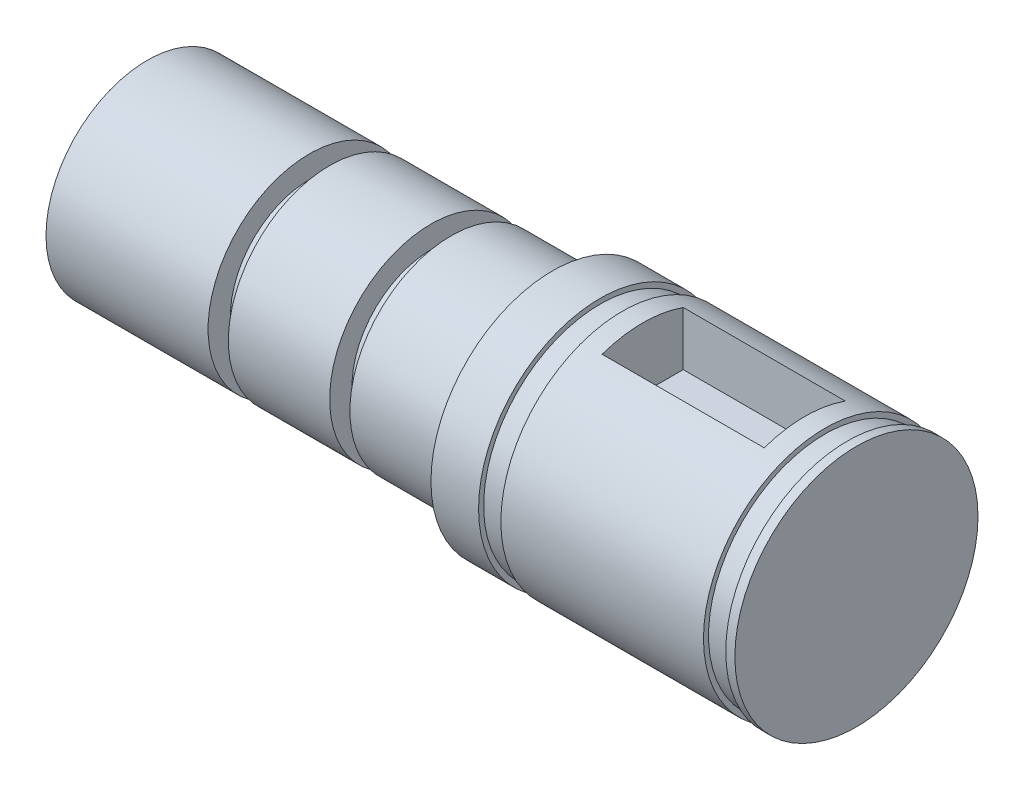
ISO-10303-21;
HEADER;
FILE_DESCRIPTION(('STEP AP214'),'2;1');
FILE_NAME('part.step','',(''),(''),'','','');
FILE_SCHEMA(('AUTOMOTIVE_DESIGN { 1 0 10303 214 1 1 1 1 }'));
ENDSEC;
DATA;
#1=APPLICATION_CONTEXT('core data for automotive mechanical design processes');
#2=APPLICATION_PROTOCOL_DEFINITION('international standard','automotive_design',2000,#1);
#3=PRODUCT_CONTEXT('',#1,'mechanical');
#4=PRODUCT('Part','Part','',(#3));
#5=PRODUCT_RELATED_PRODUCT_CATEGORY('part','',(#4));
#6=PRODUCT_DEFINITION_FORMATION('','',#4);
#7=PRODUCT_DEFINITION_CONTEXT('part definition',#1,'design');
#8=PRODUCT_DEFINITION('design','',#6,#7);
#9=PRODUCT_DEFINITION_SHAPE('','',#8);
#10=(LENGTH_UNIT() NAMED_UNIT(*) SI_UNIT(.MILLI.,.METRE.));
#11=(NAMED_UNIT(*) PLANE_ANGLE_UNIT() SI_UNIT($,.RADIAN.));
#12=(NAMED_UNIT(*) SI_UNIT($,.STERADIAN.) SOLID_ANGLE_UNIT());
#13=UNCERTAINTY_MEASURE_WITH_UNIT(LENGTH_MEASURE(1.E-05),#10,'distance_accuracy_value','');
#14=(GEOMETRIC_REPRESENTATION_CONTEXT(3) GLOBAL_UNCERTAINTY_ASSIGNED_CONTEXT((#13)) GLOBAL_UNIT_ASSIGNED_CONTEXT((#10,
#11,#12)) REPRESENTATION_CONTEXT('',''));
#15=CARTESIAN_POINT('',(0.,0.,0.));
#16=DIRECTION('',(0.,0.,1.));
#17=DIRECTION('',(1.,0.,0.));
#18=AXIS2_PLACEMENT_3D('',#15,#16,#17);
#19=CARTESIAN_POINT('',(15.,0.,0.));
#20=DIRECTION('',(-1.,0.,0.));
#21=DIRECTION('',(0.,0.,1.));
#22=AXIS2_PLACEMENT_3D('',#19,#20,#21);
#23=CYLINDRICAL_SURFACE('',#22,6.);
#24=CARTESIAN_POINT('',(13.45,0.,0.));
#25=DIRECTION('',(1.,0.,0.));
#26=DIRECTION('',(0.,0.,-1.));
#27=AXIS2_PLACEMENT_3D('',#24,#25,#26);
#28=CIRCLE('',#27,6.);
#29=CARTESIAN_POINT('',(13.45,0.,-6.));
#30=VERTEX_POINT('',#29);
#31=EDGE_CURVE('E185',#30,#30,#28,.T.);
#32=ORIENTED_EDGE('',*,*,#31,.F.);
#33=EDGE_LOOP('',(#32));
#34=FACE_BOUND('',#33,.T.);
#35=DIRECTION('',(-1.,0.,0.));
#36=VECTOR('',#35,1.);
#37=CARTESIAN_POINT('',(15.,5.65685424949238,2.));
#38=LINE('',#37,#36);
#39=CARTESIAN_POINT('',(12.45,5.65685424949238,2.));
#40=VERTEX_POINT('',#39);
#41=CARTESIAN_POINT('',(4.45,5.65685424949238,2.));
#42=VERTEX_POINT('',#41);
#43=EDGE_CURVE('E11',#40,#42,#38,.T.);
#44=ORIENTED_EDGE('',*,*,#43,.T.);
#45=CARTESIAN_POINT('',(4.45,0.,0.));
#46=DIRECTION('',(-1.,0.,0.));
#47=DIRECTION('',(0.,0.,1.));
#48=AXIS2_PLACEMENT_3D('',#45,#46,#47);
#49=CIRCLE('',#48,6.);
#50=CARTESIAN_POINT('',(4.45,5.65685424949238,-2.));
#51=VERTEX_POINT('',#50);
#52=EDGE_CURVE('E119',#42,#51,#49,.T.);
#53=ORIENTED_EDGE('',*,*,#52,.T.);
#54=DIRECTION('',(-1.,0.,0.));
#55=VECTOR('',#54,1.);
#56=CARTESIAN_POINT('',(15.,5.65685424949238,-2.));
#57=LINE('',#56,#55);
#58=CARTESIAN_POINT('',(12.45,5.65685424949238,-2.));
#59=VERTEX_POINT('',#58);
#60=EDGE_CURVE('E46',#51,#59,#57,.F.);
#61=ORIENTED_EDGE('',*,*,#60,.T.);
#62=CARTESIAN_POINT('',(12.45,0.,0.));
#63=DIRECTION('',(1.,0.,0.));
#64=DIRECTION('',(0.,0.,-1.));
#65=AXIS2_PLACEMENT_3D('',#62,#63,#64);
#66=CIRCLE('',#65,6.);
#67=EDGE_CURVE('E53',#59,#40,#66,.T.);
#68=ORIENTED_EDGE('',*,*,#67,.T.);
#69=EDGE_LOOP('',(#44,#53,#61,#68));
#70=FACE_BOUND('',#69,.T.);
#71=CARTESIAN_POINT('',(3.45,0.,0.));
#72=DIRECTION('',(1.,0.,0.));
#73=DIRECTION('',(0.,0.,-1.));
#74=AXIS2_PLACEMENT_3D('',#71,#72,#73);
#75=CIRCLE('',#74,6.);
#76=CARTESIAN_POINT('',(3.45,0.,-6.));
#77=VERTEX_POINT('',#76);
#78=EDGE_CURVE('E246',#77,#77,#75,.T.);
#79=ORIENTED_EDGE('',*,*,#78,.T.);
#80=EDGE_LOOP('',(#79));
#81=FACE_BOUND('',#80,.T.);
#82=ADVANCED_FACE('F38',(#34,#70,#81),#23,.T.);
#83=CARTESIAN_POINT('',(12.45,3.,2.));
#84=DIRECTION('',(1.,0.,0.));
#85=DIRECTION('',(0.,0.,-1.));
#86=AXIS2_PLACEMENT_3D('',#83,#84,#85);
#87=PLANE('',#86);
#88=DIRECTION('',(0.,1.,0.));
#89=VECTOR('',#88,1.);
#90=CARTESIAN_POINT('',(12.45,3.,-2.));
#91=LINE('',#90,#89);
#92=CARTESIAN_POINT('',(12.45,3.,-2.));
#93=VERTEX_POINT('',#92);
#94=EDGE_CURVE('E76',#93,#59,#91,.T.);
#95=ORIENTED_EDGE('',*,*,#94,.F.);
#96=DIRECTION('',(0.,0.,-1.));
#97=VECTOR('',#96,1.);
#98=CARTESIAN_POINT('',(12.45,3.,2.));
#99=LINE('',#98,#97);
#100=CARTESIAN_POINT('',(12.45,3.,2.));
#101=VERTEX_POINT('',#100);
#102=EDGE_CURVE('E80',#101,#93,#99,.T.);
#103=ORIENTED_EDGE('',*,*,#102,.F.);
#104=DIRECTION('',(0.,1.,0.));
#105=VECTOR('',#104,1.);
#106=CARTESIAN_POINT('',(12.45,3.,2.));
#107=LINE('',#106,#105);
#108=EDGE_CURVE('E107',#101,#40,#107,.T.);
#109=ORIENTED_EDGE('',*,*,#108,.T.);
#110=ORIENTED_EDGE('',*,*,#67,.F.);
#111=EDGE_LOOP('',(#95,#103,#109,#110));
#112=FACE_BOUND('',#111,.T.);
#113=ADVANCED_FACE('F78',(#112),#87,.F.);
#114=CARTESIAN_POINT('',(4.45,3.,2.));
#115=DIRECTION('',(0.,0.,1.));
#116=DIRECTION('',(1.,0.,0.));
#117=AXIS2_PLACEMENT_3D('',#114,#115,#116);
#118=PLANE('',#117);
#119=ORIENTED_EDGE('',*,*,#108,.F.);
#120=DIRECTION('',(1.,0.,0.));
#121=VECTOR('',#120,1.);
#122=CARTESIAN_POINT('',(4.45,3.,2.));
#123=LINE('',#122,#121);
#124=CARTESIAN_POINT('',(4.45,3.,2.));
#125=VERTEX_POINT('',#124);
#126=EDGE_CURVE('E85',#125,#101,#123,.T.);
#127=ORIENTED_EDGE('',*,*,#126,.F.);
#128=DIRECTION('',(0.,1.,0.));
#129=VECTOR('',#128,1.);
#130=CARTESIAN_POINT('',(4.45,3.,2.));
#131=LINE('',#130,#129);
#132=EDGE_CURVE('E110',#125,#42,#131,.T.);
#133=ORIENTED_EDGE('',*,*,#132,.T.);
#134=ORIENTED_EDGE('',*,*,#43,.F.);
#135=EDGE_LOOP('',(#119,#127,#133,#134));
#136=FACE_BOUND('',#135,.T.);
#137=ADVANCED_FACE('F131',(#136),#118,.F.);
#138=CARTESIAN_POINT('',(4.45,3.,2.));
#139=DIRECTION('',(-1.,0.,0.));
#140=DIRECTION('',(0.,0.,1.));
#141=AXIS2_PLACEMENT_3D('',#138,#139,#140);
#142=PLANE('',#141);
#143=ORIENTED_EDGE('',*,*,#132,.F.);
#144=DIRECTION('',(0.,0.,1.));
#145=VECTOR('',#144,1.);
#146=CARTESIAN_POINT('',(4.45,3.,2.));
#147=LINE('',#146,#145);
#148=CARTESIAN_POINT('',(4.45,3.,-2.));
#149=VERTEX_POINT('',#148);
#150=EDGE_CURVE('E94',#149,#125,#147,.T.);
#151=ORIENTED_EDGE('',*,*,#150,.F.);
#152=DIRECTION('',(0.,1.,0.));
#153=VECTOR('',#152,1.);
#154=CARTESIAN_POINT('',(4.45,3.,-2.));
#155=LINE('',#154,#153);
#156=EDGE_CURVE('E84',#149,#51,#155,.T.);
#157=ORIENTED_EDGE('',*,*,#156,.T.);
#158=ORIENTED_EDGE('',*,*,#52,.F.);
#159=EDGE_LOOP('',(#143,#151,#157,#158));
#160=FACE_BOUND('',#159,.T.);
#161=ADVANCED_FACE('F130',(#160),#142,.F.);
#162=CARTESIAN_POINT('',(4.45,3.,-2.));
#163=DIRECTION('',(0.,0.,-1.));
#164=DIRECTION('',(-1.,0.,0.));
#165=AXIS2_PLACEMENT_3D('',#162,#163,#164);
#166=PLANE('',#165);
#167=ORIENTED_EDGE('',*,*,#156,.F.);
#168=DIRECTION('',(-1.,0.,0.));
#169=VECTOR('',#168,1.);
#170=CARTESIAN_POINT('',(4.45,3.,-2.));
#171=LINE('',#170,#169);
#172=EDGE_CURVE('E88',#93,#149,#171,.T.);
#173=ORIENTED_EDGE('',*,*,#172,.F.);
#174=ORIENTED_EDGE('',*,*,#94,.T.);
#175=ORIENTED_EDGE('',*,*,#60,.F.);
#176=EDGE_LOOP('',(#167,#173,#174,#175));
#177=FACE_BOUND('',#176,.T.);
#178=ADVANCED_FACE('F89',(#177),#166,.F.);
#179=CARTESIAN_POINT('',(0.,3.,0.));
#180=DIRECTION('',(0.,-1.,0.));
#181=DIRECTION('',(0.,0.,-1.));
#182=AXIS2_PLACEMENT_3D('',#179,#180,#181);
#183=PLANE('',#182);
#184=ORIENTED_EDGE('',*,*,#102,.T.);
#185=ORIENTED_EDGE('',*,*,#172,.T.);
#186=ORIENTED_EDGE('',*,*,#150,.T.);
#187=ORIENTED_EDGE('',*,*,#126,.T.);
#188=EDGE_LOOP('',(#184,#185,#186,#187));
#189=FACE_BOUND('',#188,.T.);
#190=ADVANCED_FACE('F96',(#189),#183,.F.);
#191=CARTESIAN_POINT('',(2.35,5.75,0.));
#192=DIRECTION('',(-1.,0.,0.));
#193=DIRECTION('',(0.,0.,1.));
#194=AXIS2_PLACEMENT_3D('',#191,#192,#193);
#195=PLANE('',#194);
#196=CARTESIAN_POINT('',(2.35,0.,0.));
#197=DIRECTION('',(1.,0.,0.));
#198=DIRECTION('',(0.,0.,-1.));
#199=AXIS2_PLACEMENT_3D('',#196,#197,#198);
#200=CIRCLE('',#199,5.75);
#201=CARTESIAN_POINT('',(2.35,0.,-5.75));
#202=VERTEX_POINT('',#201);
#203=EDGE_CURVE('E188',#202,#202,#200,.T.);
#204=ORIENTED_EDGE('',*,*,#203,.F.);
#205=EDGE_LOOP('',(#204));
#206=FACE_BOUND('',#205,.T.);
#207=CARTESIAN_POINT('',(2.35,0.,0.));
#208=DIRECTION('',(1.,0.,0.));
#209=DIRECTION('',(0.,0.,-1.));
#210=AXIS2_PLACEMENT_3D('',#207,#208,#209);
#211=CIRCLE('',#210,6.);
#212=CARTESIAN_POINT('',(2.35,0.,-6.));
#213=VERTEX_POINT('',#212);
#214=EDGE_CURVE('E180',#213,#213,#211,.T.);
#215=ORIENTED_EDGE('',*,*,#214,.T.);
#216=EDGE_LOOP('',(#215));
#217=FACE_BOUND('',#216,.T.);
#218=ADVANCED_FACE('F252',(#206,#217),#195,.F.);
#219=CARTESIAN_POINT('',(3.45,6.,0.));
#220=DIRECTION('',(1.,0.,0.));
#221=DIRECTION('',(0.,0.,-1.));
#222=AXIS2_PLACEMENT_3D('',#219,#220,#221);
#223=PLANE('',#222);
#224=ORIENTED_EDGE('',*,*,#78,.F.);
#225=EDGE_LOOP('',(#224));
#226=FACE_BOUND('',#225,.T.);
#227=CARTESIAN_POINT('',(3.45,0.,0.));
#228=DIRECTION('',(1.,0.,0.));
#229=DIRECTION('',(0.,0.,-1.));
#230=AXIS2_PLACEMENT_3D('',#227,#228,#229);
#231=CIRCLE('',#230,5.75);
#232=CARTESIAN_POINT('',(3.45,0.,-5.75));
#233=VERTEX_POINT('',#232);
#234=EDGE_CURVE('E244',#233,#233,#231,.T.);
#235=ORIENTED_EDGE('',*,*,#234,.T.);
#236=EDGE_LOOP('',(#235));
#237=FACE_BOUND('',#236,.T.);
#238=ADVANCED_FACE('F325',(#226,#237),#223,.F.);
#239=CARTESIAN_POINT('',(0.,0.,0.));
#240=DIRECTION('',(1.,0.,0.));
#241=DIRECTION('',(0.,0.,-1.));
#242=AXIS2_PLACEMENT_3D('',#239,#240,#241);
#243=CYLINDRICAL_SURFACE('',#242,5.75);
#244=ORIENTED_EDGE('',*,*,#234,.F.);
#245=EDGE_LOOP('',(#244));
#246=FACE_BOUND('',#245,.T.);
#247=ORIENTED_EDGE('',*,*,#203,.T.);
#248=EDGE_LOOP('',(#247));
#249=FACE_BOUND('',#248,.T.);
#250=ADVANCED_FACE('F335',(#246,#249),#243,.T.);
#251=CARTESIAN_POINT('',(13.45,6.,0.));
#252=DIRECTION('',(-1.,0.,0.));
#253=DIRECTION('',(0.,0.,1.));
#254=AXIS2_PLACEMENT_3D('',#251,#252,#253);
#255=PLANE('',#254);
#256=CARTESIAN_POINT('',(13.45,0.,0.));
#257=DIRECTION('',(1.,0.,0.));
#258=DIRECTION('',(0.,0.,-1.));
#259=AXIS2_PLACEMENT_3D('',#256,#257,#258);
#260=CIRCLE('',#259,5.75);
#261=CARTESIAN_POINT('',(13.45,0.,-5.75));
#262=VERTEX_POINT('',#261);
#263=EDGE_CURVE('E177',#262,#262,#260,.T.);
#264=ORIENTED_EDGE('',*,*,#263,.F.);
#265=EDGE_LOOP('',(#264));
#266=FACE_BOUND('',#265,.T.);
#267=ORIENTED_EDGE('',*,*,#31,.T.);
#268=EDGE_LOOP('',(#267));
#269=FACE_BOUND('',#268,.T.);
#270=ADVANCED_FACE('F345',(#266,#269),#255,.F.);
#271=CARTESIAN_POINT('',(0.,0.,0.));
#272=DIRECTION('',(1.,0.,0.));
#273=DIRECTION('',(0.,0.,-1.));
#274=AXIS2_PLACEMENT_3D('',#271,#272,#273);
#275=CYLINDRICAL_SURFACE('',#274,5.75);
#276=CARTESIAN_POINT('',(14.55,0.,0.));
#277=DIRECTION('',(1.,0.,0.));
#278=DIRECTION('',(0.,0.,-1.));
#279=AXIS2_PLACEMENT_3D('',#276,#277,#278);
#280=CIRCLE('',#279,5.75);
#281=CARTESIAN_POINT('',(14.55,0.,-5.75));
#282=VERTEX_POINT('',#281);
#283=EDGE_CURVE('E174',#282,#282,#280,.T.);
#284=ORIENTED_EDGE('',*,*,#283,.F.);
#285=EDGE_LOOP('',(#284));
#286=FACE_BOUND('',#285,.T.);
#287=ORIENTED_EDGE('',*,*,#263,.T.);
#288=EDGE_LOOP('',(#287));
#289=FACE_BOUND('',#288,.T.);
#290=ADVANCED_FACE('F355',(#286,#289),#275,.T.);
#291=CARTESIAN_POINT('',(14.55,5.75,0.));
#292=DIRECTION('',(1.,0.,0.));
#293=DIRECTION('',(0.,0.,-1.));
#294=AXIS2_PLACEMENT_3D('',#291,#292,#293);
#295=PLANE('',#294);
#296=CARTESIAN_POINT('',(14.55,0.,0.));
#297=DIRECTION('',(1.,0.,0.));
#298=DIRECTION('',(0.,0.,-1.));
#299=AXIS2_PLACEMENT_3D('',#296,#297,#298);
#300=CIRCLE('',#299,6.);
#301=CARTESIAN_POINT('',(14.55,0.,-6.));
#302=VERTEX_POINT('',#301);
#303=EDGE_CURVE('E171',#302,#302,#300,.T.);
#304=ORIENTED_EDGE('',*,*,#303,.F.);
#305=EDGE_LOOP('',(#304));
#306=FACE_BOUND('',#305,.T.);
#307=ORIENTED_EDGE('',*,*,#283,.T.);
#308=EDGE_LOOP('',(#307));
#309=FACE_BOUND('',#308,.T.);
#310=ADVANCED_FACE('F151',(#306,#309),#295,.F.);
#311=ORIENTED_EDGE('',*,*,#214,.F.);
#312=EDGE_LOOP('',(#311));
#313=FACE_BOUND('',#312,.T.);
#314=CARTESIAN_POINT('',(0.,0.,0.));
#315=DIRECTION('',(1.,0.,0.));
#316=DIRECTION('',(0.,0.,-1.));
#317=AXIS2_PLACEMENT_3D('',#314,#315,#316);
#318=CIRCLE('',#317,6.);
#319=CARTESIAN_POINT('',(0.,0.,-6.));
#320=VERTEX_POINT('',#319);
#321=EDGE_CURVE('E115',#320,#320,#318,.T.);
#322=ORIENTED_EDGE('',*,*,#321,.T.);
#323=EDGE_LOOP('',(#322));
#324=FACE_BOUND('',#323,.T.);
#325=ADVANCED_FACE('F143',(#313,#324),#23,.T.);
#326=CARTESIAN_POINT('',(0.,0.,0.));
#327=DIRECTION('',(1.,0.,0.));
#328=DIRECTION('',(0.,0.,-1.));
#329=AXIS2_PLACEMENT_3D('',#326,#327,#328);
#330=PLANE('',#329);
#331=CARTESIAN_POINT('',(0.,0.,0.));
#332=DIRECTION('',(-1.,0.,0.));
#333=DIRECTION('',(0.,0.,1.));
#334=AXIS2_PLACEMENT_3D('',#331,#332,#333);
#335=CIRCLE('',#334,5.);
#336=CARTESIAN_POINT('',(0.,0.,5.));
#337=VERTEX_POINT('',#336);
#338=EDGE_CURVE('E116',#337,#337,#335,.T.);
#339=ORIENTED_EDGE('',*,*,#338,.F.);
#340=EDGE_LOOP('',(#339));
#341=FACE_BOUND('',#340,.T.);
#342=ORIENTED_EDGE('',*,*,#321,.F.);
#343=EDGE_LOOP('',(#342));
#344=FACE_BOUND('',#343,.T.);
#345=ADVANCED_FACE('F150',(#341,#344),#330,.F.);
#346=CARTESIAN_POINT('',(-20.,0.,0.));
#347=DIRECTION('',(1.,0.,0.));
#348=DIRECTION('',(0.,0.,-1.));
#349=AXIS2_PLACEMENT_3D('',#346,#347,#348);
#350=CYLINDRICAL_SURFACE('',#349,5.);
#351=CARTESIAN_POINT('',(-5.,0.,0.));
#352=DIRECTION('',(1.,0.,0.));
#353=DIRECTION('',(0.,0.,-1.));
#354=AXIS2_PLACEMENT_3D('',#351,#352,#353);
#355=CIRCLE('',#354,5.);
#356=CARTESIAN_POINT('',(-5.,0.,-5.));
#357=VERTEX_POINT('',#356);
#358=EDGE_CURVE('E98',#357,#357,#355,.T.);
#359=ORIENTED_EDGE('',*,*,#358,.T.);
#360=EDGE_LOOP('',(#359));
#361=FACE_BOUND('',#360,.T.);
#362=ORIENTED_EDGE('',*,*,#338,.T.);
#363=EDGE_LOOP('',(#362));
#364=FACE_BOUND('',#363,.T.);
#365=ADVANCED_FACE('F165',(#361,#364),#350,.T.);
#366=CARTESIAN_POINT('',(15.,0.,0.));
#367=DIRECTION('',(1.,0.,0.));
#368=DIRECTION('',(0.,0.,-1.));
#369=AXIS2_PLACEMENT_3D('',#366,#367,#368);
#370=PLANE('',#369);
#371=CARTESIAN_POINT('',(15.,0.,0.));
#372=DIRECTION('',(1.,0.,0.));
#373=DIRECTION('',(0.,0.,-1.));
#374=AXIS2_PLACEMENT_3D('',#371,#372,#373);
#375=CIRCLE('',#374,6.);
#376=CARTESIAN_POINT('',(15.,0.,-6.));
#377=VERTEX_POINT('',#376);
#378=EDGE_CURVE('E120',#377,#377,#375,.T.);
#379=ORIENTED_EDGE('',*,*,#378,.T.);
#380=EDGE_LOOP('',(#379));
#381=FACE_BOUND('',#380,.T.);
#382=ADVANCED_FACE('F155',(#381),#370,.T.);
#383=ORIENTED_EDGE('',*,*,#303,.T.);
#384=EDGE_LOOP('',(#383));
#385=FACE_BOUND('',#384,.T.);
#386=ORIENTED_EDGE('',*,*,#378,.F.);
#387=EDGE_LOOP('',(#386));
#388=FACE_BOUND('',#387,.T.);
#389=ADVANCED_FACE('F40',(#385,#388),#23,.T.);
#390=CARTESIAN_POINT('',(-5.,3.9,0.));
#391=DIRECTION('',(1.,0.,0.));
#392=DIRECTION('',(0.,0.,-1.));
#393=AXIS2_PLACEMENT_3D('',#390,#391,#392);
#394=PLANE('',#393);
#395=ORIENTED_EDGE('',*,*,#358,.F.);
#396=EDGE_LOOP('',(#395));
#397=FACE_BOUND('',#396,.T.);
#398=CARTESIAN_POINT('',(-5.,0.,0.));
#399=DIRECTION('',(1.,0.,0.));
#400=DIRECTION('',(0.,0.,-1.));
#401=AXIS2_PLACEMENT_3D('',#398,#399,#400);
#402=CIRCLE('',#401,3.9);
#403=CARTESIAN_POINT('',(-5.,0.,-3.9));
#404=VERTEX_POINT('',#403);
#405=EDGE_CURVE('E189',#404,#404,#402,.T.);
#406=ORIENTED_EDGE('',*,*,#405,.T.);
#407=EDGE_LOOP('',(#406));
#408=FACE_BOUND('',#407,.T.);
#409=ADVANCED_FACE('F154',(#397,#408),#394,.F.);
#410=CARTESIAN_POINT('',(-6.,5.,0.));
#411=DIRECTION('',(-1.,0.,0.));
#412=DIRECTION('',(0.,0.,1.));
#413=AXIS2_PLACEMENT_3D('',#410,#411,#412);
#414=PLANE('',#413);
#415=CARTESIAN_POINT('',(-6.,0.,0.));
#416=DIRECTION('',(1.,0.,0.));
#417=DIRECTION('',(0.,0.,-1.));
#418=AXIS2_PLACEMENT_3D('',#415,#416,#417);
#419=CIRCLE('',#418,3.9);
#420=CARTESIAN_POINT('',(-6.,0.,-3.9));
#421=VERTEX_POINT('',#420);
#422=EDGE_CURVE('E192',#421,#421,#419,.T.);
#423=ORIENTED_EDGE('',*,*,#422,.F.);
#424=EDGE_LOOP('',(#423));
#425=FACE_BOUND('',#424,.T.);
#426=CARTESIAN_POINT('',(-6.,0.,0.));
#427=DIRECTION('',(1.,0.,0.));
#428=DIRECTION('',(0.,0.,-1.));
#429=AXIS2_PLACEMENT_3D('',#426,#427,#428);
#430=CIRCLE('',#429,5.);
#431=CARTESIAN_POINT('',(-6.,0.,-5.));
#432=VERTEX_POINT('',#431);
#433=EDGE_CURVE('E101',#432,#432,#430,.T.);
#434=ORIENTED_EDGE('',*,*,#433,.T.);
#435=EDGE_LOOP('',(#434));
#436=FACE_BOUND('',#435,.T.);
#437=ADVANCED_FACE('F161',(#425,#436),#414,.F.);
#438=CARTESIAN_POINT('',(0.,0.,0.));
#439=DIRECTION('',(1.,0.,0.));
#440=DIRECTION('',(0.,0.,-1.));
#441=AXIS2_PLACEMENT_3D('',#438,#439,#440);
#442=CYLINDRICAL_SURFACE('',#441,3.9);
#443=ORIENTED_EDGE('',*,*,#405,.F.);
#444=EDGE_LOOP('',(#443));
#445=FACE_BOUND('',#444,.T.);
#446=ORIENTED_EDGE('',*,*,#422,.T.);
#447=EDGE_LOOP('',(#446));
#448=FACE_BOUND('',#447,.T.);
#449=ADVANCED_FACE('F202',(#445,#448),#442,.T.);
#450=CARTESIAN_POINT('',(-11.,0.,0.));
#451=DIRECTION('',(1.,0.,0.));
#452=DIRECTION('',(0.,0.,-1.));
#453=AXIS2_PLACEMENT_3D('',#450,#451,#452);
#454=CIRCLE('',#453,5.);
#455=CARTESIAN_POINT('',(-11.,0.,-5.));
#456=VERTEX_POINT('',#455);
#457=EDGE_CURVE('E234',#456,#456,#454,.T.);
#458=ORIENTED_EDGE('',*,*,#457,.T.);
#459=EDGE_LOOP('',(#458));
#460=FACE_BOUND('',#459,.T.);
#461=ORIENTED_EDGE('',*,*,#433,.F.);
#462=EDGE_LOOP('',(#461));
#463=FACE_BOUND('',#462,.T.);
#464=ADVANCED_FACE('F199',(#460,#463),#350,.T.);
#465=CARTESIAN_POINT('',(-11.,5.,0.));
#466=DIRECTION('',(1.,0.,0.));
#467=DIRECTION('',(0.,0.,-1.));
#468=AXIS2_PLACEMENT_3D('',#465,#466,#467);
#469=PLANE('',#468);
#470=ORIENTED_EDGE('',*,*,#457,.F.);
#471=EDGE_LOOP('',(#470));
#472=FACE_BOUND('',#471,.T.);
#473=CARTESIAN_POINT('',(-11.,0.,0.));
#474=DIRECTION('',(1.,0.,0.));
#475=DIRECTION('',(0.,0.,-1.));
#476=AXIS2_PLACEMENT_3D('',#473,#474,#475);
#477=CIRCLE('',#476,3.9);
#478=CARTESIAN_POINT('',(-11.,0.,-3.9));
#479=VERTEX_POINT('',#478);
#480=EDGE_CURVE('E193',#479,#479,#477,.T.);
#481=ORIENTED_EDGE('',*,*,#480,.T.);
#482=EDGE_LOOP('',(#481));
#483=FACE_BOUND('',#482,.T.);
#484=ADVANCED_FACE('F201',(#472,#483),#469,.F.);
#485=CARTESIAN_POINT('',(0.,0.,0.));
#486=DIRECTION('',(1.,0.,0.));
#487=DIRECTION('',(0.,0.,-1.));
#488=AXIS2_PLACEMENT_3D('',#485,#486,#487);
#489=CYLINDRICAL_SURFACE('',#488,3.9);
#490=ORIENTED_EDGE('',*,*,#480,.F.);
#491=EDGE_LOOP('',(#490));
#492=FACE_BOUND('',#491,.T.);
#493=CARTESIAN_POINT('',(-12.,0.,0.));
#494=DIRECTION('',(1.,0.,0.));
#495=DIRECTION('',(0.,0.,-1.));
#496=AXIS2_PLACEMENT_3D('',#493,#494,#495);
#497=CIRCLE('',#496,3.9);
#498=CARTESIAN_POINT('',(-12.,0.,-3.9));
#499=VERTEX_POINT('',#498);
#500=EDGE_CURVE('E233',#499,#499,#497,.T.);
#501=ORIENTED_EDGE('',*,*,#500,.T.);
#502=EDGE_LOOP('',(#501));
#503=FACE_BOUND('',#502,.T.);
#504=ADVANCED_FACE('F210',(#492,#503),#489,.T.);
#505=CARTESIAN_POINT('',(-12.,5.,0.));
#506=DIRECTION('',(-1.,0.,0.));
#507=DIRECTION('',(0.,0.,1.));
#508=AXIS2_PLACEMENT_3D('',#505,#506,#507);
#509=PLANE('',#508);
#510=ORIENTED_EDGE('',*,*,#500,.F.);
#511=EDGE_LOOP('',(#510));
#512=FACE_BOUND('',#511,.T.);
#513=CARTESIAN_POINT('',(-12.,0.,0.));
#514=DIRECTION('',(1.,0.,0.));
#515=DIRECTION('',(0.,0.,-1.));
#516=AXIS2_PLACEMENT_3D('',#513,#514,#515);
#517=CIRCLE('',#516,5.);
#518=CARTESIAN_POINT('',(-12.,0.,-5.));
#519=VERTEX_POINT('',#518);
#520=EDGE_CURVE('E230',#519,#519,#517,.T.);
#521=ORIENTED_EDGE('',*,*,#520,.T.);
#522=EDGE_LOOP('',(#521));
#523=FACE_BOUND('',#522,.T.);
#524=ADVANCED_FACE('F225',(#512,#523),#509,.F.);
#525=CARTESIAN_POINT('',(-20.,0.,0.));
#526=DIRECTION('',(-1.,0.,0.));
#527=DIRECTION('',(0.,0.,1.));
#528=AXIS2_PLACEMENT_3D('',#525,#526,#527);
#529=PLANE('',#528);
#530=CARTESIAN_POINT('',(-20.,0.,0.));
#531=DIRECTION('',(-1.,0.,0.));
#532=DIRECTION('',(0.,0.,1.));
#533=AXIS2_PLACEMENT_3D('',#530,#531,#532);
#534=CIRCLE('',#533,5.);
#535=CARTESIAN_POINT('',(-20.,0.,5.));
#536=VERTEX_POINT('',#535);
#537=EDGE_CURVE('E109',#536,#536,#534,.T.);
#538=ORIENTED_EDGE('',*,*,#537,.T.);
#539=EDGE_LOOP('',(#538));
#540=FACE_BOUND('',#539,.T.);
#541=ADVANCED_FACE('F219',(#540),#529,.T.);
#542=ORIENTED_EDGE('',*,*,#520,.F.);
#543=EDGE_LOOP('',(#542));
#544=FACE_BOUND('',#543,.T.);
#545=ORIENTED_EDGE('',*,*,#537,.F.);
#546=EDGE_LOOP('',(#545));
#547=FACE_BOUND('',#546,.T.);
#548=ADVANCED_FACE('F205',(#544,#547),#350,.T.);
#549=CLOSED_SHELL('',(#82,#113,#137,#161,#178,#190,#218,#238,#250,#270,#290,#310,#325,#345,#365,
#382,#389,#409,#437,#449,#464,#484,#504,#524,#541,#548));
#550=MANIFOLD_SOLID_BREP('B2',#549);
#551=ADVANCED_BREP_SHAPE_REPRESENTATION('',(#18,#550),#14);
#552=SHAPE_DEFINITION_REPRESENTATION(#9,#551);
ENDSEC;
END-ISO-10303-21;
